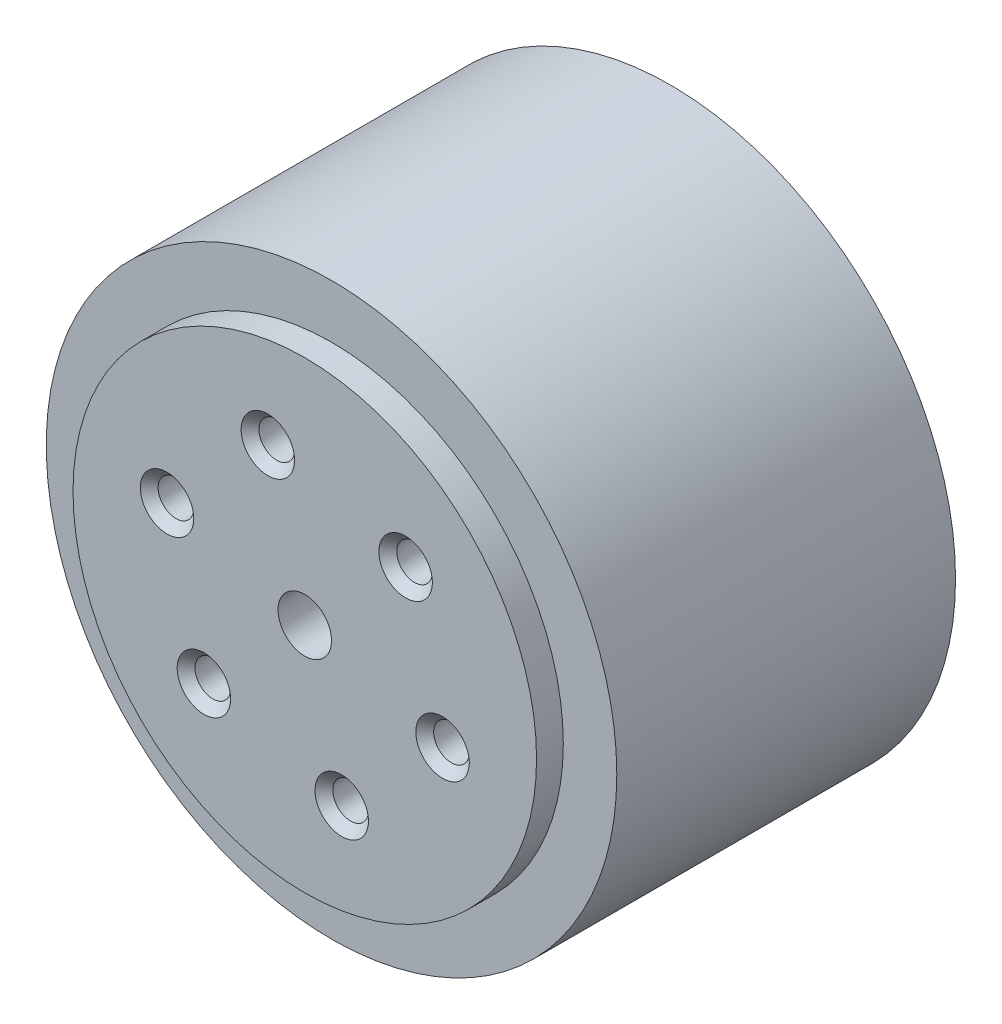
ISO-10303-21;
HEADER;
FILE_DESCRIPTION(('STEP AP214'),'2;1');
FILE_NAME('part.step','',(''),(''),'','','');
FILE_SCHEMA(('AUTOMOTIVE_DESIGN { 1 0 10303 214 1 1 1 1 }'));
ENDSEC;
DATA;
#1=APPLICATION_CONTEXT('core data for automotive mechanical design processes');
#2=APPLICATION_PROTOCOL_DEFINITION('international standard','automotive_design',2000,#1);
#3=PRODUCT_CONTEXT('',#1,'mechanical');
#4=PRODUCT('Part','Part','',(#3));
#5=PRODUCT_RELATED_PRODUCT_CATEGORY('part','',(#4));
#6=PRODUCT_DEFINITION_FORMATION('','',#4);
#7=PRODUCT_DEFINITION_CONTEXT('part definition',#1,'design');
#8=PRODUCT_DEFINITION('design','',#6,#7);
#9=PRODUCT_DEFINITION_SHAPE('','',#8);
#10=(LENGTH_UNIT() NAMED_UNIT(*) SI_UNIT(.MILLI.,.METRE.));
#11=(NAMED_UNIT(*) PLANE_ANGLE_UNIT() SI_UNIT($,.RADIAN.));
#12=(NAMED_UNIT(*) SI_UNIT($,.STERADIAN.) SOLID_ANGLE_UNIT());
#13=UNCERTAINTY_MEASURE_WITH_UNIT(LENGTH_MEASURE(1.E-05),#10,'distance_accuracy_value','');
#14=(GEOMETRIC_REPRESENTATION_CONTEXT(3) GLOBAL_UNCERTAINTY_ASSIGNED_CONTEXT((#13)) GLOBAL_UNIT_ASSIGNED_CONTEXT((#10,
#11,#12)) REPRESENTATION_CONTEXT('',''));
#15=CARTESIAN_POINT('',(0.,0.,0.));
#16=DIRECTION('',(0.,0.,1.));
#17=DIRECTION('',(1.,0.,0.));
#18=AXIS2_PLACEMENT_3D('',#15,#16,#17);
#19=CARTESIAN_POINT('',(0.,0.,-11.6351351351351));
#20=DIRECTION('',(0.,0.,-1.));
#21=DIRECTION('',(-1.,0.,0.));
#22=AXIS2_PLACEMENT_3D('',#19,#20,#21);
#23=CYLINDRICAL_SURFACE('',#22,1.50000000000001);
#24=CARTESIAN_POINT('',(0.,0.,10.3648648648649));
#25=DIRECTION('',(0.,0.,-1.));
#26=DIRECTION('',(-1.,0.,0.));
#27=AXIS2_PLACEMENT_3D('',#24,#25,#26);
#28=CIRCLE('',#27,1.50000000000001);
#29=CARTESIAN_POINT('',(-1.50000000000001,0.,10.3648648648649));
#30=VERTEX_POINT('',#29);
#31=EDGE_CURVE('E108',#30,#30,#28,.T.);
#32=ORIENTED_EDGE('',*,*,#31,.F.);
#33=EDGE_LOOP('',(#32));
#34=FACE_BOUND('',#33,.T.);
#35=CARTESIAN_POINT('',(0.,0.,3.36486486486487));
#36=DIRECTION('',(0.,0.,-1.));
#37=DIRECTION('',(-1.,0.,0.));
#38=AXIS2_PLACEMENT_3D('',#35,#36,#37);
#39=CIRCLE('',#38,1.50000000000001);
#40=CARTESIAN_POINT('',(-1.50000000000001,0.,3.36486486486487));
#41=VERTEX_POINT('',#40);
#42=EDGE_CURVE('E105',#41,#41,#39,.T.);
#43=ORIENTED_EDGE('',*,*,#42,.T.);
#44=EDGE_LOOP('',(#43));
#45=FACE_BOUND('',#44,.T.);
#46=CARTESIAN_POINT('',(1.50000000000001,0.,8.11486486486486));
#47=CARTESIAN_POINT('',(1.49999760600509,0.0593787688504971,8.114862416485));
#48=CARTESIAN_POINT('',(1.49644333306023,0.118775657075964,8.1106036009512));
#49=CARTESIAN_POINT('',(1.48255383426959,0.235591229710264,8.09388351515919));
#50=CARTESIAN_POINT('',(1.47221358646979,0.293008415894374,8.08141617016459));
#51=CARTESIAN_POINT('',(1.4457133798592,0.403915034737322,8.04920876416135));
#52=CARTESIAN_POINT('',(1.42958821794708,0.457425697494258,8.02951217186582));
#53=CARTESIAN_POINT('',(1.39264614580736,0.559920458095062,7.98385649676847));
#54=CARTESIAN_POINT('',(1.37182765054184,0.608903018804501,7.95789529806765));
#55=CARTESIAN_POINT('',(1.31836960624057,0.718951202770202,7.89013719481349));
#56=CARTESIAN_POINT('',(1.28419684309182,0.777846384687492,7.84602628946201));
#57=CARTESIAN_POINT('',(1.2121190437134,0.886006690341648,7.74960618508914));
#58=CARTESIAN_POINT('',(1.17420376089563,0.935244207719107,7.69727423263947));
#59=CARTESIAN_POINT('',(1.09699547821861,1.02476981505215,7.58434053141662));
#60=CARTESIAN_POINT('',(1.05768996729308,1.06487540714462,7.52360365386026));
#61=CARTESIAN_POINT('',(0.982473378237875,1.13460946975339,7.39451419261807));
#62=CARTESIAN_POINT('',(0.946552565043541,1.16426870455503,7.3261847641137));
#63=CARTESIAN_POINT('',(0.898966702929848,1.20096809386344,7.21401718668825));
#64=CARTESIAN_POINT('',(0.883683453779631,1.2121691769959,7.17309901622414));
#65=CARTESIAN_POINT('',(0.857964009892286,1.23050643018312,7.08892377344592));
#66=CARTESIAN_POINT('',(0.847516062002465,1.23765246650147,7.04567266088176));
#67=CARTESIAN_POINT('',(0.833105139761373,1.24740539483339,6.95698105809862));
#68=CARTESIAN_POINT('',(0.829222605301818,1.24995600781898,6.91152033403337));
#69=CARTESIAN_POINT('',(0.829091490172122,1.25004286433054,6.82058410966685));
#70=CARTESIAN_POINT('',(0.832843009565357,1.24757904212979,6.77510860917971));
#71=CARTESIAN_POINT('',(0.847707888605674,1.23752620102327,6.68210131502589));
#72=CARTESIAN_POINT('',(0.859408312457,1.2295274513961,6.63471366226726));
#73=CARTESIAN_POINT('',(0.888442533165839,1.20871318849993,6.54276371902536));
#74=CARTESIAN_POINT('',(0.905794997455986,1.19588169148343,6.49821138398819));
#75=CARTESIAN_POINT('',(0.955139134708277,1.15722563130129,6.38676046716957));
#76=CARTESIAN_POINT('',(0.989734541742281,1.1281992385967,6.32214998465889));
#77=CARTESIAN_POINT('',(1.06176362696162,1.06071724104507,6.19983612585321));
#78=CARTESIAN_POINT('',(1.09920229401551,1.02224478491079,6.14214537082415));
#79=CARTESIAN_POINT('',(1.17538495988873,0.933838554257828,6.03074445208158));
#80=CARTESIAN_POINT('',(1.21409510992801,0.883411408236022,5.97739916847657));
#81=CARTESIAN_POINT('',(1.28754911495833,0.772419565040685,5.87930523442595));
#82=CARTESIAN_POINT('',(1.32230145708776,0.711877274428579,5.83453804269647));
#83=CARTESIAN_POINT('',(1.3771438938296,0.597056314168986,5.76515805403375));
#84=CARTESIAN_POINT('',(1.39874156893191,0.544863772530691,5.73829357892184));
#85=CARTESIAN_POINT('',(1.43653920142359,0.435535617240912,5.69169332918846));
#86=CARTESIAN_POINT('',(1.45274252741889,0.378403116632042,5.67195310504039));
#87=CARTESIAN_POINT('',(1.4785491218404,0.25997718059176,5.64065628426698));
#88=CARTESIAN_POINT('',(1.48810139016472,0.198655468325024,5.62916290415023));
#89=CARTESIAN_POINT('',(1.4994571872496,0.0742799817039887,5.61551023629556));
#90=CARTESIAN_POINT('',(1.50126590049909,0.0112273946835258,5.61334470334267));
#91=CARTESIAN_POINT('',(1.49722498729297,-0.106655102299898,5.61819608995355));
#92=CARTESIAN_POINT('',(1.49226673517921,-0.161565285324156,5.62414419463725));
#93=CARTESIAN_POINT('',(1.47662796570525,-0.269322467292317,5.64299832955456));
#94=CARTESIAN_POINT('',(1.465946761932,-0.322169217931429,5.65590519442574));
#95=CARTESIAN_POINT('',(1.43944754113185,-0.425282807428052,5.68817659937776));
#96=CARTESIAN_POINT('',(1.42356257517914,-0.475505558665491,5.70762539701721));
#97=CARTESIAN_POINT('',(1.38768087304246,-0.57182928685619,5.75206254355215));
#98=CARTESIAN_POINT('',(1.36768261713728,-0.617928731328816,5.77705294014798));
#99=CARTESIAN_POINT('',(1.31487441147004,-0.725338376691835,5.84408150632977));
#100=CARTESIAN_POINT('',(1.2803451352154,-0.784177111169769,5.8887345112412));
#101=CARTESIAN_POINT('',(1.20761833212685,-0.892139643516491,5.98628169089253));
#102=CARTESIAN_POINT('',(1.16940960315472,-0.941232285418774,6.03920135864043));
#103=CARTESIAN_POINT('',(1.09176431315107,-1.03033901299864,6.15335281733454));
#104=CARTESIAN_POINT('',(1.05231803111603,-1.07017375330096,6.21471709549893));
#105=CARTESIAN_POINT('',(0.97710586032517,-1.13922410535013,6.34515744501295));
#106=CARTESIAN_POINT('',(0.941328217251967,-1.1684744432838,6.41420730758372));
#107=CARTESIAN_POINT('',(0.894635188877062,-1.20418713962595,6.52701384957034));
#108=CARTESIAN_POINT('',(0.879855535045275,-1.21494166451887,6.56778580329617));
#109=CARTESIAN_POINT('',(0.855213348293523,-1.23241118575507,6.6515871382768));
#110=CARTESIAN_POINT('',(0.845338546087737,-1.23913627036995,6.69461058613605));
#111=CARTESIAN_POINT('',(0.832077095797274,-1.24808646608227,6.78268474519588));
#112=CARTESIAN_POINT('',(0.828766313990414,-1.25025897513146,6.82775307181334));
#113=CARTESIAN_POINT('',(0.829621484389425,-1.2496910063161,6.91779092904083));
#114=CARTESIAN_POINT('',(0.833789408096124,-1.24694923297196,6.96276043047005));
#115=CARTESIAN_POINT('',(0.849464182651598,-1.23632620681835,7.05570236083086));
#116=CARTESIAN_POINT('',(0.861705472805855,-1.22792861456551,7.10348442673984));
#117=CARTESIAN_POINT('',(0.891795027098452,-1.20625214805456,7.19612607157329));
#118=CARTESIAN_POINT('',(0.909661806430648,-1.19295712996403,7.24097540066332));
#119=CARTESIAN_POINT('',(0.960293381079603,-1.1529905403742,7.3532066630149));
#120=CARTESIAN_POINT('',(0.995623570298286,-1.12305667484072,7.41824619389799));
#121=CARTESIAN_POINT('',(1.06893108151573,-1.05354944095063,7.5412745007613));
#122=CARTESIAN_POINT('',(1.10691297478661,-1.01395911755889,7.59925060315148));
#123=CARTESIAN_POINT('',(1.18384825527249,-0.923157683511313,7.71085561824453));
#124=CARTESIAN_POINT('',(1.22275805975962,-0.87147223483386,7.76413234936665));
#125=CARTESIAN_POINT('',(1.29628639574612,-0.757765343279686,7.86180016949049));
#126=CARTESIAN_POINT('',(1.33091436227145,-0.695767358080654,7.90621093241304));
#127=CARTESIAN_POINT('',(1.38471086227029,-0.579278005881018,7.97402138177179));
#128=CARTESIAN_POINT('',(1.40556069252783,-0.526999500141226,7.99988396517714));
#129=CARTESIAN_POINT('',(1.44180748060129,-0.417719782772097,8.04447435457443));
#130=CARTESIAN_POINT('',(1.45721170036657,-0.360724986716845,8.06321166496068));
#131=CARTESIAN_POINT('',(1.47929369322444,-0.253310041564181,8.08995906120825));
#132=CARTESIAN_POINT('',(1.48701070119818,-0.203422739425022,8.09925241687848));
#133=CARTESIAN_POINT('',(1.49736462476333,-0.102361357783522,8.11170605808275));
#134=CARTESIAN_POINT('',(1.50000206374106,-0.0511874114043508,8.1148669754884));
#135=CARTESIAN_POINT('',(1.50000000000001,0.,8.11486486486486));
#136=B_SPLINE_CURVE_WITH_KNOTS('',3,(#46,#47,#48,#49,#50,#51,#52,#53,#54,#55,#56,#57,#58,#59,
#60,#61,#62,#63,#64,#65,#66,#67,#68,#69,#70,#71,#72,#73,#74,#75,#76,#77,#78,#79,#80,#81,#82,#83,
#84,#85,#86,#87,#88,#89,#90,#91,#92,#93,#94,#95,#96,#97,#98,#99,#100,#101,#102,#103,#104,#105,
#106,#107,#108,#109,#110,#111,#112,#113,#114,#115,#116,#117,#118,#119,#120,#121,#122,#123,#124,
#125,#126,#127,#128,#129,#130,#131,#132,#133,#134,#135),.UNSPECIFIED.,.T.,.F.,(4,2,2,2,2,2,2,2,
2,2,2,2,2,2,2,2,2,2,2,2,2,2,2,2,2,2,2,2,2,2,2,2,2,2,2,2,2,2,2,2,2,2,2,2,4),(0.,
0.177920638407557,0.355973095513481,0.532972026797755,0.71003082415058,0.952125893800634,
1.19490321558388,1.44217376408651,1.6887098948694,1.8236131816748,1.95818681458038,
2.09439761612091,2.23061020305627,2.37816635242837,2.52621487430064,2.76143398970638,
2.99707581215812,3.24501566810457,3.49241341014755,3.67933989515109,3.86614943036559,
4.05437609196182,4.24247671173501,4.40804641875284,4.57363598871257,4.74144560410125,
4.90931733118538,5.15261089108602,5.39667010414658,5.64512295341129,5.8927531045298,
6.02641745468306,6.15974574356465,6.29460624678875,6.42950230652138,6.57876724728641,
6.72852869227189,6.9667704132835,7.20543349464897,7.45579032127007,7.70558526561257,
7.89070171070698,8.07557035570187,8.22896247938919,8.38233879708319),.UNSPECIFIED.);
#137=CARTESIAN_POINT('',(1.50000000000001,0.,8.11486486486486));
#138=VERTEX_POINT('',#137);
#139=EDGE_CURVE('E138',#138,#138,#136,.T.);
#140=ORIENTED_EDGE('',*,*,#139,.F.);
#141=EDGE_LOOP('',(#140));
#142=FACE_BOUND('',#141,.T.);
#143=CARTESIAN_POINT('',(-1.50000000000001,0.,8.11486486486486));
#144=CARTESIAN_POINT('',(-1.49999760600509,-0.0593787688504971,8.114862416485));
#145=CARTESIAN_POINT('',(-1.49644333306023,-0.118775657075964,8.1106036009512));
#146=CARTESIAN_POINT('',(-1.48255383426959,-0.235591229710264,8.09388351515919));
#147=CARTESIAN_POINT('',(-1.47221358646979,-0.293008415894374,8.08141617016459));
#148=CARTESIAN_POINT('',(-1.4457133798592,-0.403915034737322,8.04920876416135));
#149=CARTESIAN_POINT('',(-1.42958821794708,-0.457425697494258,8.02951217186582));
#150=CARTESIAN_POINT('',(-1.39264614580736,-0.559920458095062,7.98385649676847));
#151=CARTESIAN_POINT('',(-1.37182765054184,-0.608903018804501,7.95789529806765));
#152=CARTESIAN_POINT('',(-1.31836960624057,-0.718951202770202,7.89013719481349));
#153=CARTESIAN_POINT('',(-1.28419684309182,-0.777846384687492,7.84602628946201));
#154=CARTESIAN_POINT('',(-1.2121190437134,-0.886006690341648,7.74960618508914));
#155=CARTESIAN_POINT('',(-1.17420376089563,-0.935244207719107,7.69727423263947));
#156=CARTESIAN_POINT('',(-1.09699547821861,-1.02476981505215,7.58434053141662));
#157=CARTESIAN_POINT('',(-1.05768996729308,-1.06487540714462,7.52360365386026));
#158=CARTESIAN_POINT('',(-0.982473378237875,-1.13460946975339,7.39451419261807));
#159=CARTESIAN_POINT('',(-0.946552565043541,-1.16426870455503,7.3261847641137));
#160=CARTESIAN_POINT('',(-0.898966702929848,-1.20096809386344,7.21401718668825));
#161=CARTESIAN_POINT('',(-0.883683453779631,-1.2121691769959,7.17309901622414));
#162=CARTESIAN_POINT('',(-0.857964009892286,-1.23050643018312,7.08892377344592));
#163=CARTESIAN_POINT('',(-0.847516062002465,-1.23765246650147,7.04567266088176));
#164=CARTESIAN_POINT('',(-0.833105139761373,-1.24740539483339,6.95698105809862));
#165=CARTESIAN_POINT('',(-0.829222605301818,-1.24995600781898,6.91152033403337));
#166=CARTESIAN_POINT('',(-0.829091490172122,-1.25004286433054,6.82058410966685));
#167=CARTESIAN_POINT('',(-0.832843009565357,-1.24757904212979,6.77510860917971));
#168=CARTESIAN_POINT('',(-0.847707888605674,-1.23752620102327,6.68210131502589));
#169=CARTESIAN_POINT('',(-0.859408312457,-1.2295274513961,6.63471366226726));
#170=CARTESIAN_POINT('',(-0.888442533165839,-1.20871318849993,6.54276371902536));
#171=CARTESIAN_POINT('',(-0.905794997455986,-1.19588169148343,6.49821138398819));
#172=CARTESIAN_POINT('',(-0.955139134708277,-1.15722563130129,6.38676046716957));
#173=CARTESIAN_POINT('',(-0.989734541742281,-1.1281992385967,6.32214998465889));
#174=CARTESIAN_POINT('',(-1.06176362696162,-1.06071724104507,6.19983612585321));
#175=CARTESIAN_POINT('',(-1.09920229401551,-1.02224478491079,6.14214537082415));
#176=CARTESIAN_POINT('',(-1.17538495988873,-0.933838554257828,6.03074445208158));
#177=CARTESIAN_POINT('',(-1.21409510992801,-0.883411408236022,5.97739916847657));
#178=CARTESIAN_POINT('',(-1.28754911495833,-0.772419565040685,5.87930523442595));
#179=CARTESIAN_POINT('',(-1.32230145708776,-0.711877274428579,5.83453804269647));
#180=CARTESIAN_POINT('',(-1.3771438938296,-0.597056314168986,5.76515805403375));
#181=CARTESIAN_POINT('',(-1.39874156893191,-0.544863772530691,5.73829357892184));
#182=CARTESIAN_POINT('',(-1.43653920142359,-0.435535617240912,5.69169332918846));
#183=CARTESIAN_POINT('',(-1.45274252741889,-0.378403116632042,5.67195310504039));
#184=CARTESIAN_POINT('',(-1.4785491218404,-0.25997718059176,5.64065628426698));
#185=CARTESIAN_POINT('',(-1.48810139016472,-0.198655468325024,5.62916290415023));
#186=CARTESIAN_POINT('',(-1.4994571872496,-0.0742799817039887,5.61551023629556));
#187=CARTESIAN_POINT('',(-1.50126590049909,-0.0112273946835258,5.61334470334267));
#188=CARTESIAN_POINT('',(-1.49722498729297,0.106655102299898,5.61819608995355));
#189=CARTESIAN_POINT('',(-1.49226673517921,0.161565285324156,5.62414419463725));
#190=CARTESIAN_POINT('',(-1.47662796570525,0.269322467292317,5.64299832955456));
#191=CARTESIAN_POINT('',(-1.465946761932,0.322169217931429,5.65590519442574));
#192=CARTESIAN_POINT('',(-1.43944754113185,0.425282807428052,5.68817659937776));
#193=CARTESIAN_POINT('',(-1.42356257517914,0.475505558665491,5.70762539701721));
#194=CARTESIAN_POINT('',(-1.38768087304246,0.57182928685619,5.75206254355215));
#195=CARTESIAN_POINT('',(-1.36768261713728,0.617928731328816,5.77705294014798));
#196=CARTESIAN_POINT('',(-1.31487441147004,0.725338376691835,5.84408150632977));
#197=CARTESIAN_POINT('',(-1.2803451352154,0.784177111169769,5.8887345112412));
#198=CARTESIAN_POINT('',(-1.20761833212685,0.892139643516491,5.98628169089253));
#199=CARTESIAN_POINT('',(-1.16940960315472,0.941232285418774,6.03920135864043));
#200=CARTESIAN_POINT('',(-1.09176431315107,1.03033901299864,6.15335281733454));
#201=CARTESIAN_POINT('',(-1.05231803111603,1.07017375330096,6.21471709549893));
#202=CARTESIAN_POINT('',(-0.97710586032517,1.13922410535013,6.34515744501295));
#203=CARTESIAN_POINT('',(-0.941328217251967,1.1684744432838,6.41420730758372));
#204=CARTESIAN_POINT('',(-0.894635188877062,1.20418713962595,6.52701384957034));
#205=CARTESIAN_POINT('',(-0.879855535045275,1.21494166451887,6.56778580329617));
#206=CARTESIAN_POINT('',(-0.855213348293523,1.23241118575507,6.6515871382768));
#207=CARTESIAN_POINT('',(-0.845338546087737,1.23913627036995,6.69461058613605));
#208=CARTESIAN_POINT('',(-0.832077095797274,1.24808646608227,6.78268474519588));
#209=CARTESIAN_POINT('',(-0.828766313990414,1.25025897513146,6.82775307181334));
#210=CARTESIAN_POINT('',(-0.829621484389425,1.2496910063161,6.91779092904083));
#211=CARTESIAN_POINT('',(-0.833789408096124,1.24694923297196,6.96276043047005));
#212=CARTESIAN_POINT('',(-0.849464182651598,1.23632620681835,7.05570236083086));
#213=CARTESIAN_POINT('',(-0.861705472805855,1.22792861456551,7.10348442673984));
#214=CARTESIAN_POINT('',(-0.891795027098452,1.20625214805456,7.19612607157329));
#215=CARTESIAN_POINT('',(-0.909661806430648,1.19295712996403,7.24097540066332));
#216=CARTESIAN_POINT('',(-0.960293381079603,1.1529905403742,7.3532066630149));
#217=CARTESIAN_POINT('',(-0.995623570298286,1.12305667484072,7.41824619389799));
#218=CARTESIAN_POINT('',(-1.06893108151573,1.05354944095063,7.5412745007613));
#219=CARTESIAN_POINT('',(-1.10691297478661,1.01395911755889,7.59925060315148));
#220=CARTESIAN_POINT('',(-1.18384825527249,0.923157683511313,7.71085561824453));
#221=CARTESIAN_POINT('',(-1.22275805975962,0.87147223483386,7.76413234936665));
#222=CARTESIAN_POINT('',(-1.29628639574612,0.757765343279686,7.86180016949049));
#223=CARTESIAN_POINT('',(-1.33091436227145,0.695767358080654,7.90621093241304));
#224=CARTESIAN_POINT('',(-1.38471086227029,0.579278005881018,7.97402138177179));
#225=CARTESIAN_POINT('',(-1.40556069252783,0.526999500141226,7.99988396517714));
#226=CARTESIAN_POINT('',(-1.44180748060129,0.417719782772097,8.04447435457443));
#227=CARTESIAN_POINT('',(-1.45721170036657,0.360724986716845,8.06321166496068));
#228=CARTESIAN_POINT('',(-1.47929369322444,0.253310041564181,8.08995906120825));
#229=CARTESIAN_POINT('',(-1.48701070119818,0.203422739425022,8.09925241687848));
#230=CARTESIAN_POINT('',(-1.49736462476333,0.102361357783522,8.11170605808275));
#231=CARTESIAN_POINT('',(-1.50000206374106,0.0511874114043508,8.1148669754884));
#232=CARTESIAN_POINT('',(-1.50000000000001,0.,8.11486486486486));
#233=B_SPLINE_CURVE_WITH_KNOTS('',3,(#143,#144,#145,#146,#147,#148,#149,#150,#151,#152,#153,
#154,#155,#156,#157,#158,#159,#160,#161,#162,#163,#164,#165,#166,#167,#168,#169,#170,#171,#172,
#173,#174,#175,#176,#177,#178,#179,#180,#181,#182,#183,#184,#185,#186,#187,#188,#189,#190,#191,
#192,#193,#194,#195,#196,#197,#198,#199,#200,#201,#202,#203,#204,#205,#206,#207,#208,#209,#210,
#211,#212,#213,#214,#215,#216,#217,#218,#219,#220,#221,#222,#223,#224,#225,#226,#227,#228,#229,
#230,#231,#232),.UNSPECIFIED.,.T.,.F.,(4,2,2,2,2,2,2,2,2,2,2,2,2,2,2,2,2,2,2,2,2,2,2,2,2,2,2,2,
2,2,2,2,2,2,2,2,2,2,2,2,2,2,2,2,4),(0.,0.177920638407557,0.355973095513481,0.532972026797755,
0.71003082415058,0.952125893800634,1.19490321558388,1.44217376408651,1.6887098948694,
1.8236131816748,1.95818681458038,2.09439761612091,2.23061020305627,2.37816635242837,
2.52621487430064,2.76143398970638,2.99707581215812,3.24501566810457,3.49241341014755,
3.67933989515109,3.86614943036559,4.05437609196182,4.24247671173501,4.40804641875284,
4.57363598871257,4.74144560410125,4.90931733118538,5.15261089108602,5.39667010414658,
5.64512295341129,5.8927531045298,6.02641745468306,6.15974574356465,6.29460624678875,
6.42950230652138,6.57876724728641,6.72852869227189,6.9667704132835,7.20543349464897,
7.45579032127007,7.70558526561257,7.89070171070698,8.07557035570187,8.22896247938919,
8.38233879708319),.UNSPECIFIED.);
#234=CARTESIAN_POINT('',(-1.50000000000001,0.,8.11486486486486));
#235=VERTEX_POINT('',#234);
#236=EDGE_CURVE('E165',#235,#235,#233,.T.);
#237=ORIENTED_EDGE('',*,*,#236,.F.);
#238=EDGE_LOOP('',(#237));
#239=FACE_BOUND('',#238,.T.);
#240=ADVANCED_FACE('F49',(#34,#45,#142,#239),#23,.F.);
#241=CARTESIAN_POINT('',(7.72740661031254,-2.07055236082018,10.3648648648649));
#242=DIRECTION('',(0.,0.,1.));
#243=DIRECTION('',(1.,0.,0.));
#244=AXIS2_PLACEMENT_3D('',#241,#242,#243);
#245=CYLINDRICAL_SURFACE('',#244,0.999999999999997);
#246=CARTESIAN_POINT('',(7.72740661031254,-2.07055236082018,9.86486486486615));
#247=DIRECTION('',(0.,0.,1.));
#248=DIRECTION('',(1.,0.,0.));
#249=AXIS2_PLACEMENT_3D('',#246,#247,#248);
#250=CIRCLE('',#249,0.999999999999997);
#251=CARTESIAN_POINT('',(8.72740661031254,-2.07055236082018,9.86486486486615));
#252=VERTEX_POINT('',#251);
#253=EDGE_CURVE('E283',#252,#252,#250,.T.);
#254=ORIENTED_EDGE('',*,*,#253,.T.);
#255=EDGE_LOOP('',(#254));
#256=FACE_BOUND('',#255,.T.);
#257=CARTESIAN_POINT('',(7.72740661031254,-2.07055236082018,3.36486486486487));
#258=DIRECTION('',(0.,0.,1.));
#259=DIRECTION('',(1.,0.,0.));
#260=AXIS2_PLACEMENT_3D('',#257,#258,#259);
#261=CIRCLE('',#260,0.999999999999997);
#262=CARTESIAN_POINT('',(8.69333243660162,-2.3293714059227,3.36486486486487));
#263=VERTEX_POINT('',#262);
#264=EDGE_CURVE('E297',#263,#263,#261,.T.);
#265=ORIENTED_EDGE('',*,*,#264,.F.);
#266=EDGE_LOOP('',(#265));
#267=FACE_BOUND('',#266,.T.);
#268=CARTESIAN_POINT('',(7.72740661031254,-1.07055236082019,6.21956056242893));
#269=CARTESIAN_POINT('',(7.7582968944858,-1.07055434706662,6.21956148294196));
#270=CARTESIAN_POINT('',(7.78921645411234,-1.07199814287119,6.22194044905018));
#271=CARTESIAN_POINT('',(7.85009078065255,-1.0776342674969,6.23143490342235));
#272=CARTESIAN_POINT('',(7.88004408870466,-1.08183056538987,6.23855723177989));
#273=CARTESIAN_POINT('',(7.93797220665558,-1.09252975778041,6.25741515224636));
#274=CARTESIAN_POINT('',(7.96594993583038,-1.09902915969963,6.2691437619885));
#275=CARTESIAN_POINT('',(8.01915159238893,-1.11365799547514,6.29696422579234));
#276=CARTESIAN_POINT('',(8.04437664651103,-1.12178675849893,6.31305428513695));
#277=CARTESIAN_POINT('',(8.09075631205378,-1.13858258333707,6.3486253971317));
#278=CARTESIAN_POINT('',(8.11201289134683,-1.14722513557289,6.36798582191868));
#279=CARTESIAN_POINT('',(8.15108558091579,-1.16448762300298,6.40991192518131));
#280=CARTESIAN_POINT('',(8.1689010416378,-1.17310755362483,6.43247820740993));
#281=CARTESIAN_POINT('',(8.20220909494159,-1.19024521629887,6.48204163750644));
#282=CARTESIAN_POINT('',(8.21742354900858,-1.19870575771892,6.50924492764293));
#283=CARTESIAN_POINT('',(8.24383723131733,-1.21408669145382,6.56593717307252));
#284=CARTESIAN_POINT('',(8.25503441563617,-1.22100629908892,6.59542728261005));
#285=CARTESIAN_POINT('',(8.27462677122464,-1.23347349193417,6.65939119907955));
#286=CARTESIAN_POINT('',(8.28256470853164,-1.23877898699342,6.69405234671279));
#287=CARTESIAN_POINT('',(8.29390626731365,-1.24646225006368,6.76442842703475));
#288=CARTESIAN_POINT('',(8.29730750490555,-1.24883847879408,6.80014390367129));
#289=CARTESIAN_POINT('',(8.29980116559458,-1.25057157525596,6.87517620193557));
#290=CARTESIAN_POINT('',(8.29845790147829,-1.249623202692,6.91451558670736));
#291=CARTESIAN_POINT('',(8.29041923183314,-1.2440899311758,6.99239993935237));
#292=CARTESIAN_POINT('',(8.28372210713639,-1.23950386413414,7.03094464796983));
#293=CARTESIAN_POINT('',(8.26458286236459,-1.22700364361756,7.10663426776596));
#294=CARTESIAN_POINT('',(8.25206077122851,-1.21904330427155,7.14375164519538));
#295=CARTESIAN_POINT('',(8.22090381631664,-1.20061789483651,7.21465899289011));
#296=CARTESIAN_POINT('',(8.2022732924665,-1.1901546044698,7.24845130345542));
#297=CARTESIAN_POINT('',(8.16056017254637,-1.16895578297328,7.30868721913177));
#298=CARTESIAN_POINT('',(8.13797651149472,-1.15831521377583,7.3355082168463));
#299=CARTESIAN_POINT('',(8.0877952485553,-1.13735651286092,7.38411611365933));
#300=CARTESIAN_POINT('',(8.06020238129424,-1.12703808736049,7.40590772265636));
#301=CARTESIAN_POINT('',(8.00436514418593,-1.10927953842782,7.44135914421867));
#302=CARTESIAN_POINT('',(7.97660434194062,-1.10164217369349,7.45568414481953));
#303=CARTESIAN_POINT('',(7.91859331736675,-1.08854954429068,7.47947507003872));
#304=CARTESIAN_POINT('',(7.88834390691434,-1.08309357134849,7.4889425721162));
#305=CARTESIAN_POINT('',(7.82862130986719,-1.07526524164325,7.50232889935522));
#306=CARTESIAN_POINT('',(7.7992525154559,-1.07269694539811,7.50660216235008));
#307=CARTESIAN_POINT('',(7.74009669081482,-1.07019515807114,7.51076627202962));
#308=CARTESIAN_POINT('',(7.71030974026373,-1.07026117166085,7.51065794258373));
#309=CARTESIAN_POINT('',(7.65180990078345,-1.07299264281197,7.50610834832884));
#310=CARTESIAN_POINT('',(7.62308751660805,-1.07560469535215,7.50175610203191));
#311=CARTESIAN_POINT('',(7.56690043758557,-1.08311066537344,7.48890502693904));
#312=CARTESIAN_POINT('',(7.53943561896593,-1.08800435775774,7.48040660718299));
#313=CARTESIAN_POINT('',(7.48638380486031,-1.0996510191969,7.45934954597035));
#314=CARTESIAN_POINT('',(7.46080597581181,-1.10641239247539,7.44677250586512));
#315=CARTESIAN_POINT('',(7.41229366997047,-1.12115912645838,7.41782511563282));
#316=CARTESIAN_POINT('',(7.38935935004303,-1.12914455973295,7.40145454057135));
#317=CARTESIAN_POINT('',(7.34585040463398,-1.14590241450205,7.36469287879793));
#318=CARTESIAN_POINT('',(7.32538197233834,-1.15469232810549,7.3441844266102));
#319=CARTESIAN_POINT('',(7.28799302174281,-1.17203048388315,7.30007302672745));
#320=CARTESIAN_POINT('',(7.27107368947493,-1.18057864444574,7.27646904884403));
#321=CARTESIAN_POINT('',(7.23959447195476,-1.19740604628518,7.22474830531523));
#322=CARTESIAN_POINT('',(7.22534003609425,-1.20560634077174,7.19642043119912));
#323=CARTESIAN_POINT('',(7.20091509096617,-1.22025255323908,7.13763423424938));
#324=CARTESIAN_POINT('',(7.19074658666972,-1.22669760942387,7.10717487407954));
#325=CARTESIAN_POINT('',(7.17336873757471,-1.23798841755047,7.0412856892318));
#326=CARTESIAN_POINT('',(7.16663037683292,-1.24256722242362,7.0056856409527));
#327=CARTESIAN_POINT('',(7.1577819744311,-1.24863026729883,6.93365102967796));
#328=CARTESIAN_POINT('',(7.15567439850966,-1.25011285864957,6.89721603252707));
#329=CARTESIAN_POINT('',(7.15602975750615,-1.24986362389394,6.82124452096718));
#330=CARTESIAN_POINT('',(7.15889981680402,-1.24784546671964,6.78170977274824));
#331=CARTESIAN_POINT('',(7.17013529894886,-1.24019432561629,6.70377010135552));
#332=CARTESIAN_POINT('',(7.17850195620484,-1.23456052970481,6.66536543399642));
#333=CARTESIAN_POINT('',(7.20103125249731,-1.22019520787547,6.59089384308196));
#334=CARTESIAN_POINT('',(7.21519245928285,-1.21146444751173,6.55482634439374));
#335=CARTESIAN_POINT('',(7.24962474824675,-1.19185205376759,6.48637611782546));
#336=CARTESIAN_POINT('',(7.26989030915264,-1.18097236709891,6.45399009642722));
#337=CARTESIAN_POINT('',(7.3143619258124,-1.1595407728099,6.39710058971206));
#338=CARTESIAN_POINT('',(7.33801539866437,-1.14905487709219,6.37214159500971));
#339=CARTESIAN_POINT('',(7.39000434940145,-1.12878087496754,6.3273142466008));
#340=CARTESIAN_POINT('',(7.41833731726982,-1.11899239848184,6.30744317829457));
#341=CARTESIAN_POINT('',(7.47526064182273,-1.10246370310422,6.27549219171192));
#342=CARTESIAN_POINT('',(7.50342814223696,-1.09550030079819,6.26277050922704));
#343=CARTESIAN_POINT('',(7.56188754826077,-1.08389810027169,6.24212347515908));
#344=CARTESIAN_POINT('',(7.59217568230161,-1.07925528885638,6.23418983823701));
#345=CARTESIAN_POINT('',(7.64017879020773,-1.07421329803575,6.22566462002673));
#346=CARTESIAN_POINT('',(7.65751321545895,-1.07284527897942,6.22337733683259));
#347=CARTESIAN_POINT('',(7.69236414970158,-1.07101422330439,6.22032500719219));
#348=CARTESIAN_POINT('',(7.70988066814494,-1.07055123390145,6.21956004016575));
#349=CARTESIAN_POINT('',(7.72740661031254,-1.07055236082019,6.21956056242893));
#350=B_SPLINE_CURVE_WITH_KNOTS('',3,(#268,#269,#270,#271,#272,#273,#274,#275,#276,#277,#278,
#279,#280,#281,#282,#283,#284,#285,#286,#287,#288,#289,#290,#291,#292,#293,#294,#295,#296,#297,
#298,#299,#300,#301,#302,#303,#304,#305,#306,#307,#308,#309,#310,#311,#312,#313,#314,#315,#316,
#317,#318,#319,#320,#321,#322,#323,#324,#325,#326,#327,#328,#329,#330,#331,#332,#333,#334,#335,
#336,#337,#338,#339,#340,#341,#342,#343,#344,#345,#346,#347,#348,#349),.UNSPECIFIED.,.T.,.F.,(4,
2,2,2,2,2,2,2,2,2,2,2,2,2,2,2,2,2,2,2,2,2,2,2,2,2,2,2,2,2,2,2,2,2,2,2,2,2,2,2,4),(0.,
0.0925978725577963,0.185329564437965,0.27792122948435,0.370474851161543,0.460158371612727,
0.549858804434351,0.646353241700684,0.742896704410827,0.850306624199359,0.957772962082402,
1.0753542809018,1.192973371206,1.31225720124646,1.43145646537067,1.54074533348113,
1.64993143617771,1.74589487190229,1.84182712401115,1.93076008052671,2.01967631508447,
2.10676673669689,2.19384856815876,2.28132882111945,2.36881426247443,2.45926195513698,
2.54973982546696,2.64760528544256,2.74551870963396,2.85462189256684,2.96378315524477,
3.08229848742631,3.20084044451806,3.31935311902793,3.43775892131238,3.54498711707967,
3.65215798280502,3.74671395909404,3.84110584096941,3.89363952085833,3.94617594137777),.UNSPECIFIED.);
#351=CARTESIAN_POINT('',(7.72740661031254,-1.07055236082019,6.21956056242893));
#352=VERTEX_POINT('',#351);
#353=EDGE_CURVE('E130',#352,#352,#350,.T.);
#354=ORIENTED_EDGE('',*,*,#353,.F.);
#355=EDGE_LOOP('',(#354));
#356=FACE_BOUND('',#355,.T.);
#357=ADVANCED_FACE('F141',(#256,#267,#356),#245,.F.);
#358=CARTESIAN_POINT('',(0.,0.,-10.1351351351351));
#359=DIRECTION('',(0.,0.,1.));
#360=DIRECTION('',(1.,0.,0.));
#361=AXIS2_PLACEMENT_3D('',#358,#359,#360);
#362=CYLINDRICAL_SURFACE('',#361,16.);
#363=CARTESIAN_POINT('',(0.,0.,-10.1351351351351));
#364=DIRECTION('',(0.,0.,1.));
#365=DIRECTION('',(1.,0.,0.));
#366=AXIS2_PLACEMENT_3D('',#363,#364,#365);
#367=CIRCLE('',#366,16.);
#368=CARTESIAN_POINT('',(16.,0.,-10.1351351351351));
#369=VERTEX_POINT('',#368);
#370=EDGE_CURVE('E125',#369,#369,#367,.T.);
#371=ORIENTED_EDGE('',*,*,#370,.T.);
#372=EDGE_LOOP('',(#371));
#373=FACE_BOUND('',#372,.T.);
#374=CARTESIAN_POINT('',(0.,0.,8.86486486486487));
#375=DIRECTION('',(0.,0.,1.));
#376=DIRECTION('',(1.,0.,0.));
#377=AXIS2_PLACEMENT_3D('',#374,#375,#376);
#378=CIRCLE('',#377,16.);
#379=CARTESIAN_POINT('',(16.,0.,8.86486486486486));
#380=VERTEX_POINT('',#379);
#381=EDGE_CURVE('E122',#380,#380,#378,.T.);
#382=ORIENTED_EDGE('',*,*,#381,.F.);
#383=EDGE_LOOP('',(#382));
#384=FACE_BOUND('',#383,.T.);
#385=ADVANCED_FACE('F201',(#373,#384),#362,.T.);
#386=CARTESIAN_POINT('',(16.,0.,-10.1351351351351));
#387=DIRECTION('',(0.,0.,-1.));
#388=DIRECTION('',(-1.,0.,0.));
#389=AXIS2_PLACEMENT_3D('',#386,#387,#388);
#390=PLANE('',#389);
#391=CARTESIAN_POINT('',(0.,0.,-10.1351351351351));
#392=DIRECTION('',(0.,0.,-1.));
#393=DIRECTION('',(-1.,0.,0.));
#394=AXIS2_PLACEMENT_3D('',#391,#392,#393);
#395=CIRCLE('',#394,13.);
#396=CARTESIAN_POINT('',(-13.,0.,-10.1351351351351));
#397=VERTEX_POINT('',#396);
#398=EDGE_CURVE('E115',#397,#397,#395,.T.);
#399=ORIENTED_EDGE('',*,*,#398,.F.);
#400=EDGE_LOOP('',(#399));
#401=FACE_BOUND('',#400,.T.);
#402=ORIENTED_EDGE('',*,*,#370,.F.);
#403=EDGE_LOOP('',(#402));
#404=FACE_BOUND('',#403,.T.);
#405=ADVANCED_FACE('F197',(#401,#404),#390,.T.);
#406=CARTESIAN_POINT('',(0.,0.,8.86486486486487));
#407=DIRECTION('',(0.,0.,1.));
#408=DIRECTION('',(1.,0.,0.));
#409=AXIS2_PLACEMENT_3D('',#406,#407,#408);
#410=PLANE('',#409);
#411=CARTESIAN_POINT('',(0.,0.,8.86486486486487));
#412=DIRECTION('',(0.,0.,1.));
#413=DIRECTION('',(1.,0.,0.));
#414=AXIS2_PLACEMENT_3D('',#411,#412,#413);
#415=CIRCLE('',#414,13.);
#416=CARTESIAN_POINT('',(13.,0.,8.86486486486487));
#417=VERTEX_POINT('',#416);
#418=EDGE_CURVE('E119',#417,#417,#415,.T.);
#419=ORIENTED_EDGE('',*,*,#418,.F.);
#420=EDGE_LOOP('',(#419));
#421=FACE_BOUND('',#420,.T.);
#422=ORIENTED_EDGE('',*,*,#381,.T.);
#423=EDGE_LOOP('',(#422));
#424=FACE_BOUND('',#423,.T.);
#425=ADVANCED_FACE('F193',(#421,#424),#410,.T.);
#426=CARTESIAN_POINT('',(0.,0.,10.3648648648649));
#427=DIRECTION('',(0.,0.,-1.));
#428=DIRECTION('',(-1.,0.,0.));
#429=AXIS2_PLACEMENT_3D('',#426,#427,#428);
#430=CYLINDRICAL_SURFACE('',#429,13.);
#431=CARTESIAN_POINT('',(0.,0.,10.3648648648649));
#432=DIRECTION('',(0.,0.,1.));
#433=DIRECTION('',(1.,0.,0.));
#434=AXIS2_PLACEMENT_3D('',#431,#432,#433);
#435=CIRCLE('',#434,13.);
#436=CARTESIAN_POINT('',(13.,0.,10.3648648648649));
#437=VERTEX_POINT('',#436);
#438=EDGE_CURVE('E114',#437,#437,#435,.T.);
#439=ORIENTED_EDGE('',*,*,#438,.F.);
#440=EDGE_LOOP('',(#439));
#441=FACE_BOUND('',#440,.T.);
#442=ORIENTED_EDGE('',*,*,#418,.T.);
#443=EDGE_LOOP('',(#442));
#444=FACE_BOUND('',#443,.T.);
#445=ADVANCED_FACE('F189',(#441,#444),#430,.T.);
#446=CARTESIAN_POINT('',(0.,0.,10.3648648648649));
#447=DIRECTION('',(0.,0.,1.));
#448=DIRECTION('',(1.,0.,0.));
#449=AXIS2_PLACEMENT_3D('',#446,#447,#448);
#450=PLANE('',#449);
#451=CARTESIAN_POINT('',(7.72740661031254,-2.07055236082018,10.3648648648649));
#452=DIRECTION('',(0.,0.,1.));
#453=DIRECTION('',(1.,0.,0.));
#454=AXIS2_PLACEMENT_3D('',#451,#452,#453);
#455=CIRCLE('',#454,1.50000000000128);
#456=CARTESIAN_POINT('',(9.22740661031382,-2.07055236082018,10.3648648648649));
#457=VERTEX_POINT('',#456);
#458=EDGE_CURVE('E267',#457,#457,#455,.F.);
#459=ORIENTED_EDGE('',*,*,#458,.T.);
#460=EDGE_LOOP('',(#459));
#461=FACE_BOUND('',#460,.T.);
#462=CARTESIAN_POINT('',(2.07055236082013,-7.72740661031255,10.3648648648649));
#463=DIRECTION('',(0.,0.,1.));
#464=DIRECTION('',(1.,0.,0.));
#465=AXIS2_PLACEMENT_3D('',#462,#463,#464);
#466=CIRCLE('',#465,1.50000000000128);
#467=CARTESIAN_POINT('',(3.57055236082141,-7.72740661031255,10.3648648648649));
#468=VERTEX_POINT('',#467);
#469=EDGE_CURVE('E270',#468,#468,#466,.F.);
#470=ORIENTED_EDGE('',*,*,#469,.T.);
#471=EDGE_LOOP('',(#470));
#472=FACE_BOUND('',#471,.T.);
#473=CARTESIAN_POINT('',(-5.65685424949242,-5.65685424949234,10.3648648648649));
#474=DIRECTION('',(0.,0.,1.));
#475=DIRECTION('',(1.,0.,0.));
#476=AXIS2_PLACEMENT_3D('',#473,#474,#475);
#477=CIRCLE('',#476,1.50000000000128);
#478=CARTESIAN_POINT('',(-4.15685424949114,-5.65685424949234,10.3648648648649));
#479=VERTEX_POINT('',#478);
#480=EDGE_CURVE('E273',#479,#479,#477,.F.);
#481=ORIENTED_EDGE('',*,*,#480,.T.);
#482=EDGE_LOOP('',(#481));
#483=FACE_BOUND('',#482,.T.);
#484=CARTESIAN_POINT('',(-7.72740661031253,2.07055236082024,10.3648648648649));
#485=DIRECTION('',(0.,0.,1.));
#486=DIRECTION('',(1.,0.,0.));
#487=AXIS2_PLACEMENT_3D('',#484,#485,#486);
#488=CIRCLE('',#487,1.50000000000128);
#489=CARTESIAN_POINT('',(-6.22740661031125,2.07055236082024,10.3648648648649));
#490=VERTEX_POINT('',#489);
#491=EDGE_CURVE('E276',#490,#490,#488,.F.);
#492=ORIENTED_EDGE('',*,*,#491,.T.);
#493=EDGE_LOOP('',(#492));
#494=FACE_BOUND('',#493,.T.);
#495=CARTESIAN_POINT('',(-2.07055236082008,7.72740661031257,10.3648648648649));
#496=DIRECTION('',(0.,0.,1.));
#497=DIRECTION('',(1.,0.,0.));
#498=AXIS2_PLACEMENT_3D('',#495,#496,#497);
#499=CIRCLE('',#498,1.50000000000128);
#500=CARTESIAN_POINT('',(-0.570552360818797,7.72740661031257,10.3648648648649));
#501=VERTEX_POINT('',#500);
#502=EDGE_CURVE('E253',#501,#501,#499,.F.);
#503=ORIENTED_EDGE('',*,*,#502,.T.);
#504=EDGE_LOOP('',(#503));
#505=FACE_BOUND('',#504,.T.);
#506=CARTESIAN_POINT('',(5.65685424949238,5.65685424949238,10.3648648648649));
#507=DIRECTION('',(0.,0.,1.));
#508=DIRECTION('',(1.,0.,0.));
#509=AXIS2_PLACEMENT_3D('',#506,#507,#508);
#510=CIRCLE('',#509,1.50000000000128);
#511=CARTESIAN_POINT('',(7.15685424949366,5.65685424949238,10.3648648648649));
#512=VERTEX_POINT('',#511);
#513=EDGE_CURVE('E280',#512,#512,#510,.F.);
#514=ORIENTED_EDGE('',*,*,#513,.T.);
#515=EDGE_LOOP('',(#514));
#516=FACE_BOUND('',#515,.T.);
#517=ORIENTED_EDGE('',*,*,#31,.T.);
#518=EDGE_LOOP('',(#517));
#519=FACE_BOUND('',#518,.T.);
#520=ORIENTED_EDGE('',*,*,#438,.T.);
#521=EDGE_LOOP('',(#520));
#522=FACE_BOUND('',#521,.T.);
#523=ADVANCED_FACE('F185',(#461,#472,#483,#494,#505,#516,#519,#522),#450,.T.);
#524=CARTESIAN_POINT('',(0.,0.,-11.6351351351351));
#525=DIRECTION('',(0.,0.,1.));
#526=DIRECTION('',(1.,0.,0.));
#527=AXIS2_PLACEMENT_3D('',#524,#525,#526);
#528=CYLINDRICAL_SURFACE('',#527,13.);
#529=CARTESIAN_POINT('',(0.,0.,-11.6351351351351));
#530=DIRECTION('',(0.,0.,-1.));
#531=DIRECTION('',(-1.,0.,0.));
#532=AXIS2_PLACEMENT_3D('',#529,#530,#531);
#533=CIRCLE('',#532,13.);
#534=CARTESIAN_POINT('',(-13.,0.,-11.6351351351351));
#535=VERTEX_POINT('',#534);
#536=EDGE_CURVE('E111',#535,#535,#533,.T.);
#537=ORIENTED_EDGE('',*,*,#536,.F.);
#538=EDGE_LOOP('',(#537));
#539=FACE_BOUND('',#538,.T.);
#540=ORIENTED_EDGE('',*,*,#398,.T.);
#541=EDGE_LOOP('',(#540));
#542=FACE_BOUND('',#541,.T.);
#543=ADVANCED_FACE('F181',(#539,#542),#528,.T.);
#544=CARTESIAN_POINT('',(0.,0.,-11.6351351351351));
#545=DIRECTION('',(0.,0.,-1.));
#546=DIRECTION('',(-1.,0.,0.));
#547=AXIS2_PLACEMENT_3D('',#544,#545,#546);
#548=PLANE('',#547);
#549=CARTESIAN_POINT('',(0.,0.,-11.6351351351351));
#550=DIRECTION('',(0.,0.,-1.));
#551=DIRECTION('',(-1.,0.,0.));
#552=AXIS2_PLACEMENT_3D('',#549,#550,#551);
#553=CIRCLE('',#552,9.50000000000129);
#554=CARTESIAN_POINT('',(-9.50000000000129,0.,-11.6351351351351));
#555=VERTEX_POINT('',#554);
#556=EDGE_CURVE('E285',#555,#555,#553,.F.);
#557=ORIENTED_EDGE('',*,*,#556,.T.);
#558=EDGE_LOOP('',(#557));
#559=FACE_BOUND('',#558,.T.);
#560=ORIENTED_EDGE('',*,*,#536,.T.);
#561=EDGE_LOOP('',(#560));
#562=FACE_BOUND('',#561,.T.);
#563=ADVANCED_FACE('F177',(#559,#562),#548,.T.);
#564=CARTESIAN_POINT('',(1.50000000000001,0.,3.36486486486487));
#565=DIRECTION('',(0.,0.,1.));
#566=DIRECTION('',(1.,0.,0.));
#567=AXIS2_PLACEMENT_3D('',#564,#565,#566);
#568=PLANE('',#567);
#569=ORIENTED_EDGE('',*,*,#42,.F.);
#570=EDGE_LOOP('',(#569));
#571=FACE_BOUND('',#570,.T.);
#572=CARTESIAN_POINT('',(0.,0.,3.36486486486487));
#573=DIRECTION('',(0.,0.,-1.));
#574=DIRECTION('',(-1.,0.,0.));
#575=AXIS2_PLACEMENT_3D('',#572,#573,#574);
#576=CIRCLE('',#575,9.00000000000001);
#577=CARTESIAN_POINT('',(-2.32937140592259,8.69333243660165,3.36486486486487));
#578=VERTEX_POINT('',#577);
#579=CARTESIAN_POINT('',(6.36396103067893,6.36396103067893,3.36486486486487));
#580=VERTEX_POINT('',#579);
#581=EDGE_CURVE('E97',#578,#580,#576,.T.);
#582=ORIENTED_EDGE('',*,*,#581,.T.);
#583=CARTESIAN_POINT('',(5.65685424949238,5.65685424949238,3.36486486486487));
#584=DIRECTION('',(0.,0.,1.));
#585=DIRECTION('',(1.,0.,0.));
#586=AXIS2_PLACEMENT_3D('',#583,#584,#585);
#587=CIRCLE('',#586,0.999999999999996);
#588=EDGE_CURVE('E63',#580,#580,#587,.T.);
#589=ORIENTED_EDGE('',*,*,#588,.T.);
#590=EDGE_CURVE('E69',#580,#263,#576,.T.);
#591=ORIENTED_EDGE('',*,*,#590,.T.);
#592=ORIENTED_EDGE('',*,*,#264,.T.);
#593=CARTESIAN_POINT('',(2.32937140592265,-8.69333243660163,3.36486486486487));
#594=VERTEX_POINT('',#593);
#595=EDGE_CURVE('E296',#263,#594,#576,.T.);
#596=ORIENTED_EDGE('',*,*,#595,.T.);
#597=CARTESIAN_POINT('',(2.07055236082013,-7.72740661031255,3.36486486486487));
#598=DIRECTION('',(0.,0.,1.));
#599=DIRECTION('',(1.,0.,0.));
#600=AXIS2_PLACEMENT_3D('',#597,#598,#599);
#601=CIRCLE('',#600,0.999999999999996);
#602=EDGE_CURVE('E298',#594,#594,#601,.T.);
#603=ORIENTED_EDGE('',*,*,#602,.T.);
#604=CARTESIAN_POINT('',(-6.36396103067898,-6.36396103067889,3.36486486486487));
#605=VERTEX_POINT('',#604);
#606=EDGE_CURVE('E305',#594,#605,#576,.T.);
#607=ORIENTED_EDGE('',*,*,#606,.T.);
#608=CARTESIAN_POINT('',(-5.65685424949242,-5.65685424949234,3.36486486486487));
#609=DIRECTION('',(0.,0.,1.));
#610=DIRECTION('',(1.,0.,0.));
#611=AXIS2_PLACEMENT_3D('',#608,#609,#610);
#612=CIRCLE('',#611,0.999999999999996);
#613=EDGE_CURVE('E101',#605,#605,#612,.T.);
#614=ORIENTED_EDGE('',*,*,#613,.T.);
#615=CARTESIAN_POINT('',(-8.6933324366016,2.32937140592277,3.36486486486487));
#616=VERTEX_POINT('',#615);
#617=EDGE_CURVE('E95',#605,#616,#576,.T.);
#618=ORIENTED_EDGE('',*,*,#617,.T.);
#619=CARTESIAN_POINT('',(-7.72740661031253,2.07055236082024,3.36486486486487));
#620=DIRECTION('',(0.,0.,1.));
#621=DIRECTION('',(1.,0.,0.));
#622=AXIS2_PLACEMENT_3D('',#619,#620,#621);
#623=CIRCLE('',#622,0.999999999999996);
#624=EDGE_CURVE('E92',#616,#616,#623,.T.);
#625=ORIENTED_EDGE('',*,*,#624,.T.);
#626=EDGE_CURVE('E85',#616,#578,#576,.T.);
#627=ORIENTED_EDGE('',*,*,#626,.T.);
#628=CARTESIAN_POINT('',(-2.07055236082008,7.72740661031257,3.36486486486487));
#629=DIRECTION('',(0.,0.,1.));
#630=DIRECTION('',(1.,0.,0.));
#631=AXIS2_PLACEMENT_3D('',#628,#629,#630);
#632=CIRCLE('',#631,0.999999999999996);
#633=EDGE_CURVE('E89',#578,#578,#632,.T.);
#634=ORIENTED_EDGE('',*,*,#633,.T.);
#635=EDGE_LOOP('',(#582,#589,#591,#592,#596,#603,#607,#614,#618,#625,#627,#634));
#636=FACE_BOUND('',#635,.T.);
#637=ADVANCED_FACE('F88',(#571,#636),#568,.F.);
#638=CARTESIAN_POINT('',(0.,0.,-11.6351351351351));
#639=DIRECTION('',(0.,0.,-1.));
#640=DIRECTION('',(-1.,0.,0.));
#641=AXIS2_PLACEMENT_3D('',#638,#639,#640);
#642=CYLINDRICAL_SURFACE('',#641,9.00000000000001);
#643=CARTESIAN_POINT('',(0.,0.,-11.1351351351364));
#644=DIRECTION('',(0.,0.,-1.));
#645=DIRECTION('',(-1.,0.,0.));
#646=AXIS2_PLACEMENT_3D('',#643,#644,#645);
#647=CIRCLE('',#646,9.00000000000001);
#648=CARTESIAN_POINT('',(-9.00000000000001,0.,-11.1351351351364));
#649=VERTEX_POINT('',#648);
#650=EDGE_CURVE('E118',#649,#649,#647,.T.);
#651=ORIENTED_EDGE('',*,*,#650,.T.);
#652=EDGE_LOOP('',(#651));
#653=FACE_BOUND('',#652,.T.);
#654=ORIENTED_EDGE('',*,*,#590,.F.);
#655=ORIENTED_EDGE('',*,*,#581,.F.);
#656=ORIENTED_EDGE('',*,*,#626,.F.);
#657=ORIENTED_EDGE('',*,*,#617,.F.);
#658=ORIENTED_EDGE('',*,*,#606,.F.);
#659=ORIENTED_EDGE('',*,*,#595,.F.);
#660=EDGE_LOOP('',(#654,#655,#656,#657,#658,#659));
#661=FACE_BOUND('',#660,.T.);
#662=ADVANCED_FACE('F291',(#653,#661),#642,.F.);
#663=CARTESIAN_POINT('',(-2.07055236082008,7.72740661031257,10.3648648648649));
#664=DIRECTION('',(0.,0.,1.));
#665=DIRECTION('',(1.,0.,0.));
#666=AXIS2_PLACEMENT_3D('',#663,#664,#665);
#667=CYLINDRICAL_SURFACE('',#666,0.999999999999996);
#668=CARTESIAN_POINT('',(-2.07055236082008,7.72740661031257,9.86486486486615));
#669=DIRECTION('',(0.,0.,1.));
#670=DIRECTION('',(1.,0.,0.));
#671=AXIS2_PLACEMENT_3D('',#668,#669,#670);
#672=CIRCLE('',#671,0.999999999999996);
#673=CARTESIAN_POINT('',(-1.07055236082008,7.72740661031257,9.86486486486615));
#674=VERTEX_POINT('',#673);
#675=EDGE_CURVE('E58',#674,#674,#672,.T.);
#676=ORIENTED_EDGE('',*,*,#675,.T.);
#677=EDGE_LOOP('',(#676));
#678=FACE_BOUND('',#677,.T.);
#679=ORIENTED_EDGE('',*,*,#633,.F.);
#680=EDGE_LOOP('',(#679));
#681=FACE_BOUND('',#680,.T.);
#682=ADVANCED_FACE('F99',(#678,#681),#667,.F.);
#683=CARTESIAN_POINT('',(-7.72740661031253,2.07055236082024,10.3648648648649));
#684=DIRECTION('',(0.,0.,1.));
#685=DIRECTION('',(1.,0.,0.));
#686=AXIS2_PLACEMENT_3D('',#683,#684,#685);
#687=CYLINDRICAL_SURFACE('',#686,0.999999999999996);
#688=CARTESIAN_POINT('',(-7.72740661031253,2.07055236082024,9.86486486486615));
#689=DIRECTION('',(0.,0.,1.));
#690=DIRECTION('',(1.,0.,0.));
#691=AXIS2_PLACEMENT_3D('',#688,#689,#690);
#692=CIRCLE('',#691,0.999999999999996);
#693=CARTESIAN_POINT('',(-6.72740661031253,2.07055236082024,9.86486486486615));
#694=VERTEX_POINT('',#693);
#695=EDGE_CURVE('E257',#694,#694,#692,.T.);
#696=ORIENTED_EDGE('',*,*,#695,.T.);
#697=EDGE_LOOP('',(#696));
#698=FACE_BOUND('',#697,.T.);
#699=ORIENTED_EDGE('',*,*,#624,.F.);
#700=EDGE_LOOP('',(#699));
#701=FACE_BOUND('',#700,.T.);
#702=ADVANCED_FACE('F318',(#698,#701),#687,.F.);
#703=CARTESIAN_POINT('',(-5.65685424949242,-5.65685424949234,10.3648648648649));
#704=DIRECTION('',(0.,0.,1.));
#705=DIRECTION('',(1.,0.,0.));
#706=AXIS2_PLACEMENT_3D('',#703,#704,#705);
#707=CYLINDRICAL_SURFACE('',#706,0.999999999999996);
#708=CARTESIAN_POINT('',(-5.65685424949242,-5.65685424949234,9.86486486486615));
#709=DIRECTION('',(0.,0.,1.));
#710=DIRECTION('',(1.,0.,0.));
#711=AXIS2_PLACEMENT_3D('',#708,#709,#710);
#712=CIRCLE('',#711,0.999999999999996);
#713=CARTESIAN_POINT('',(-4.65685424949242,-5.65685424949234,9.86486486486615));
#714=VERTEX_POINT('',#713);
#715=EDGE_CURVE('E259',#714,#714,#712,.T.);
#716=ORIENTED_EDGE('',*,*,#715,.T.);
#717=EDGE_LOOP('',(#716));
#718=FACE_BOUND('',#717,.T.);
#719=ORIENTED_EDGE('',*,*,#613,.F.);
#720=EDGE_LOOP('',(#719));
#721=FACE_BOUND('',#720,.T.);
#722=ADVANCED_FACE('F311',(#718,#721),#707,.F.);
#723=CARTESIAN_POINT('',(2.07055236082013,-7.72740661031255,10.3648648648649));
#724=DIRECTION('',(0.,0.,1.));
#725=DIRECTION('',(1.,0.,0.));
#726=AXIS2_PLACEMENT_3D('',#723,#724,#725);
#727=CYLINDRICAL_SURFACE('',#726,0.999999999999996);
#728=CARTESIAN_POINT('',(2.07055236082013,-7.72740661031255,9.86486486486615));
#729=DIRECTION('',(0.,0.,1.));
#730=DIRECTION('',(1.,0.,0.));
#731=AXIS2_PLACEMENT_3D('',#728,#729,#730);
#732=CIRCLE('',#731,0.999999999999996);
#733=CARTESIAN_POINT('',(3.07055236082012,-7.72740661031255,9.86486486486615));
#734=VERTEX_POINT('',#733);
#735=EDGE_CURVE('E264',#734,#734,#732,.T.);
#736=ORIENTED_EDGE('',*,*,#735,.T.);
#737=EDGE_LOOP('',(#736));
#738=FACE_BOUND('',#737,.T.);
#739=ORIENTED_EDGE('',*,*,#602,.F.);
#740=EDGE_LOOP('',(#739));
#741=FACE_BOUND('',#740,.T.);
#742=ADVANCED_FACE('F309',(#738,#741),#727,.F.);
#743=CARTESIAN_POINT('',(5.65685424949238,5.65685424949238,10.3648648648649));
#744=DIRECTION('',(0.,0.,1.));
#745=DIRECTION('',(1.,0.,0.));
#746=AXIS2_PLACEMENT_3D('',#743,#744,#745);
#747=CYLINDRICAL_SURFACE('',#746,0.999999999999996);
#748=CARTESIAN_POINT('',(5.65685424949238,5.65685424949238,9.86486486486615));
#749=DIRECTION('',(0.,0.,1.));
#750=DIRECTION('',(1.,0.,0.));
#751=AXIS2_PLACEMENT_3D('',#748,#749,#750);
#752=CIRCLE('',#751,0.999999999999996);
#753=CARTESIAN_POINT('',(6.65685424949238,5.65685424949238,9.86486486486615));
#754=VERTEX_POINT('',#753);
#755=EDGE_CURVE('E11',#754,#754,#752,.T.);
#756=ORIENTED_EDGE('',*,*,#755,.T.);
#757=EDGE_LOOP('',(#756));
#758=FACE_BOUND('',#757,.T.);
#759=ORIENTED_EDGE('',*,*,#588,.F.);
#760=EDGE_LOOP('',(#759));
#761=FACE_BOUND('',#760,.T.);
#762=ADVANCED_FACE('F154',(#758,#761),#747,.F.);
#763=CARTESIAN_POINT('',(10.,0.,6.86486486486486));
#764=DIRECTION('',(1.,0.,0.));
#765=DIRECTION('',(0.,0.,-1.));
#766=AXIS2_PLACEMENT_3D('',#763,#764,#765);
#767=PLANE('',#766);
#768=CARTESIAN_POINT('',(10.,0.,6.86486486486486));
#769=DIRECTION('',(1.,0.,0.));
#770=DIRECTION('',(0.,0.,-1.));
#771=AXIS2_PLACEMENT_3D('',#768,#769,#770);
#772=CIRCLE('',#771,1.25);
#773=CARTESIAN_POINT('',(10.,0.,5.61486486486486));
#774=VERTEX_POINT('',#773);
#775=EDGE_CURVE('E139',#774,#774,#772,.T.);
#776=ORIENTED_EDGE('',*,*,#775,.F.);
#777=EDGE_LOOP('',(#776));
#778=FACE_BOUND('',#777,.T.);
#779=ADVANCED_FACE('F152',(#778),#767,.F.);
#780=CARTESIAN_POINT('',(10.,0.,6.86486486486486));
#781=DIRECTION('',(-1.,0.,0.));
#782=DIRECTION('',(0.,0.,1.));
#783=AXIS2_PLACEMENT_3D('',#780,#781,#782);
#784=CYLINDRICAL_SURFACE('',#783,1.25);
#785=ORIENTED_EDGE('',*,*,#353,.T.);
#786=EDGE_LOOP('',(#785));
#787=FACE_BOUND('',#786,.T.);
#788=ORIENTED_EDGE('',*,*,#775,.T.);
#789=EDGE_LOOP('',(#788));
#790=FACE_BOUND('',#789,.T.);
#791=ORIENTED_EDGE('',*,*,#139,.T.);
#792=EDGE_LOOP('',(#791));
#793=FACE_BOUND('',#792,.T.);
#794=ADVANCED_FACE('F150',(#787,#790,#793),#784,.F.);
#795=CARTESIAN_POINT('',(-6.,0.,6.86486486486486));
#796=DIRECTION('',(1.,0.,0.));
#797=DIRECTION('',(0.,0.,-1.));
#798=AXIS2_PLACEMENT_3D('',#795,#796,#797);
#799=CIRCLE('',#798,1.25);
#800=CARTESIAN_POINT('',(-6.,0.,5.61486486486486));
#801=VERTEX_POINT('',#800);
#802=EDGE_CURVE('E516',#801,#801,#799,.T.);
#803=ORIENTED_EDGE('',*,*,#802,.F.);
#804=EDGE_LOOP('',(#803));
#805=FACE_BOUND('',#804,.T.);
#806=ORIENTED_EDGE('',*,*,#236,.T.);
#807=EDGE_LOOP('',(#806));
#808=FACE_BOUND('',#807,.T.);
#809=ADVANCED_FACE('F145',(#805,#808),#784,.F.);
#810=CARTESIAN_POINT('',(-6.,0.,6.86486486486486));
#811=DIRECTION('',(1.,0.,0.));
#812=DIRECTION('',(0.,0.,-1.));
#813=AXIS2_PLACEMENT_3D('',#810,#811,#812);
#814=PLANE('',#813);
#815=ORIENTED_EDGE('',*,*,#802,.T.);
#816=EDGE_LOOP('',(#815));
#817=FACE_BOUND('',#816,.T.);
#818=ADVANCED_FACE('F149',(#817),#814,.T.);
#819=CARTESIAN_POINT('',(0.,0.,-11.1351351351364));
#820=DIRECTION('',(0.,0.,-1.));
#821=DIRECTION('',(-1.,0.,0.));
#822=AXIS2_PLACEMENT_3D('',#819,#820,#821);
#823=CONICAL_SURFACE('',#822,9.00000000000001,0.785398163400012);
#824=ORIENTED_EDGE('',*,*,#556,.F.);
#825=EDGE_LOOP('',(#824));
#826=FACE_BOUND('',#825,.T.);
#827=ORIENTED_EDGE('',*,*,#650,.F.);
#828=EDGE_LOOP('',(#827));
#829=FACE_BOUND('',#828,.T.);
#830=ADVANCED_FACE('F207',(#826,#829),#823,.F.);
#831=CARTESIAN_POINT('',(7.72740661031254,-2.07055236082018,9.86486486486615));
#832=DIRECTION('',(0.,0.,1.));
#833=DIRECTION('',(1.,0.,0.));
#834=AXIS2_PLACEMENT_3D('',#831,#832,#833);
#835=CONICAL_SURFACE('',#834,0.999999999999997,0.78539816340001);
#836=ORIENTED_EDGE('',*,*,#458,.F.);
#837=EDGE_LOOP('',(#836));
#838=FACE_BOUND('',#837,.T.);
#839=ORIENTED_EDGE('',*,*,#253,.F.);
#840=EDGE_LOOP('',(#839));
#841=FACE_BOUND('',#840,.T.);
#842=ADVANCED_FACE('F213',(#838,#841),#835,.F.);
#843=CARTESIAN_POINT('',(2.07055236082013,-7.72740661031255,9.86486486486615));
#844=DIRECTION('',(0.,0.,1.));
#845=DIRECTION('',(1.,0.,0.));
#846=AXIS2_PLACEMENT_3D('',#843,#844,#845);
#847=CONICAL_SURFACE('',#846,0.999999999999996,0.78539816340001);
#848=ORIENTED_EDGE('',*,*,#469,.F.);
#849=EDGE_LOOP('',(#848));
#850=FACE_BOUND('',#849,.T.);
#851=ORIENTED_EDGE('',*,*,#735,.F.);
#852=EDGE_LOOP('',(#851));
#853=FACE_BOUND('',#852,.T.);
#854=ADVANCED_FACE('F220',(#850,#853),#847,.F.);
#855=CARTESIAN_POINT('',(-5.65685424949242,-5.65685424949234,9.86486486486615));
#856=DIRECTION('',(0.,0.,1.));
#857=DIRECTION('',(1.,0.,0.));
#858=AXIS2_PLACEMENT_3D('',#855,#856,#857);
#859=CONICAL_SURFACE('',#858,0.999999999999996,0.785398163400011);
#860=ORIENTED_EDGE('',*,*,#480,.F.);
#861=EDGE_LOOP('',(#860));
#862=FACE_BOUND('',#861,.T.);
#863=ORIENTED_EDGE('',*,*,#715,.F.);
#864=EDGE_LOOP('',(#863));
#865=FACE_BOUND('',#864,.T.);
#866=ADVANCED_FACE('F227',(#862,#865),#859,.F.);
#867=CARTESIAN_POINT('',(-7.72740661031253,2.07055236082024,9.86486486486615));
#868=DIRECTION('',(0.,0.,1.));
#869=DIRECTION('',(1.,0.,0.));
#870=AXIS2_PLACEMENT_3D('',#867,#868,#869);
#871=CONICAL_SURFACE('',#870,0.999999999999996,0.78539816340001);
#872=ORIENTED_EDGE('',*,*,#491,.F.);
#873=EDGE_LOOP('',(#872));
#874=FACE_BOUND('',#873,.T.);
#875=ORIENTED_EDGE('',*,*,#695,.F.);
#876=EDGE_LOOP('',(#875));
#877=FACE_BOUND('',#876,.T.);
#878=ADVANCED_FACE('F234',(#874,#877),#871,.F.);
#879=CARTESIAN_POINT('',(-2.07055236082008,7.72740661031257,9.86486486486615));
#880=DIRECTION('',(0.,0.,1.));
#881=DIRECTION('',(1.,0.,0.));
#882=AXIS2_PLACEMENT_3D('',#879,#880,#881);
#883=CONICAL_SURFACE('',#882,0.999999999999996,0.78539816340001);
#884=ORIENTED_EDGE('',*,*,#502,.F.);
#885=EDGE_LOOP('',(#884));
#886=FACE_BOUND('',#885,.T.);
#887=ORIENTED_EDGE('',*,*,#675,.F.);
#888=EDGE_LOOP('',(#887));
#889=FACE_BOUND('',#888,.T.);
#890=ADVANCED_FACE('F240',(#886,#889),#883,.F.);
#891=CARTESIAN_POINT('',(5.65685424949238,5.65685424949238,9.86486486486615));
#892=DIRECTION('',(0.,0.,1.));
#893=DIRECTION('',(1.,0.,0.));
#894=AXIS2_PLACEMENT_3D('',#891,#892,#893);
#895=CONICAL_SURFACE('',#894,0.999999999999996,0.785398163400011);
#896=ORIENTED_EDGE('',*,*,#513,.F.);
#897=EDGE_LOOP('',(#896));
#898=FACE_BOUND('',#897,.T.);
#899=ORIENTED_EDGE('',*,*,#755,.F.);
#900=EDGE_LOOP('',(#899));
#901=FACE_BOUND('',#900,.T.);
#902=ADVANCED_FACE('F52',(#898,#901),#895,.F.);
#903=CLOSED_SHELL('',(#240,#357,#385,#405,#425,#445,#523,#543,#563,#637,#662,#682,#702,#722,
#742,#762,#779,#794,#809,#818,#830,#842,#854,#866,#878,#890,#902));
#904=MANIFOLD_SOLID_BREP('B2',#903);
#905=ADVANCED_BREP_SHAPE_REPRESENTATION('',(#18,#904),#14);
#906=SHAPE_DEFINITION_REPRESENTATION(#9,#905);
ENDSEC;
END-ISO-10303-21;
